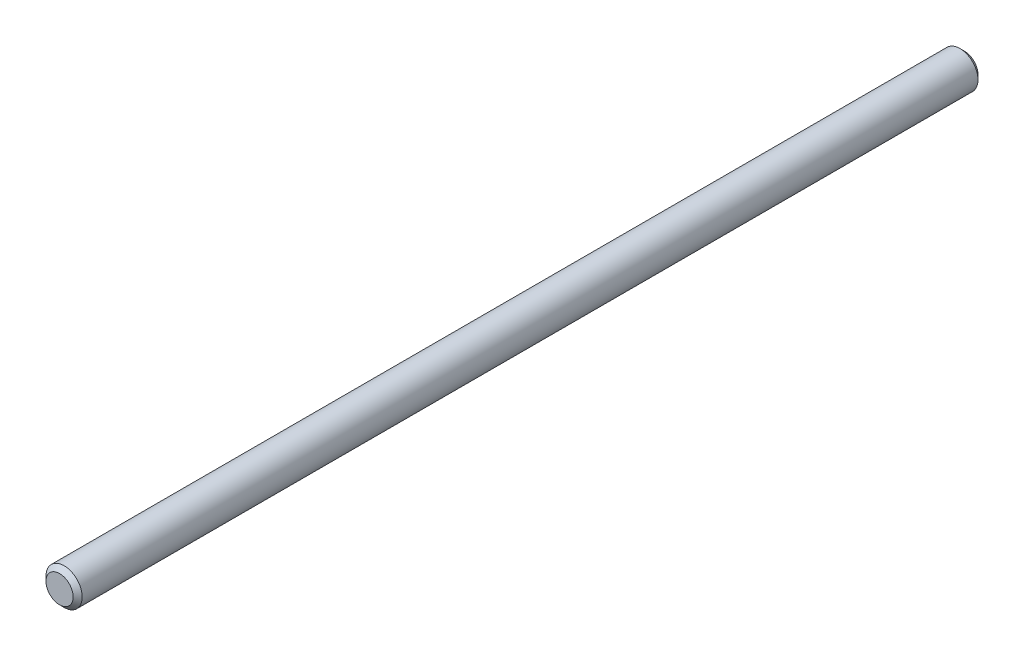
ISO-10303-21;
HEADER;
FILE_DESCRIPTION(('STEP AP214'),'2;1');
FILE_NAME('part.step','',(''),(''),'','','');
FILE_SCHEMA(('AUTOMOTIVE_DESIGN { 1 0 10303 214 1 1 1 1 }'));
ENDSEC;
DATA;
#1=APPLICATION_CONTEXT('core data for automotive mechanical design processes');
#2=APPLICATION_PROTOCOL_DEFINITION('international standard','automotive_design',2000,#1);
#3=PRODUCT_CONTEXT('',#1,'mechanical');
#4=PRODUCT('Part','Part','',(#3));
#5=PRODUCT_RELATED_PRODUCT_CATEGORY('part','',(#4));
#6=PRODUCT_DEFINITION_FORMATION('','',#4);
#7=PRODUCT_DEFINITION_CONTEXT('part definition',#1,'design');
#8=PRODUCT_DEFINITION('design','',#6,#7);
#9=PRODUCT_DEFINITION_SHAPE('','',#8);
#10=(LENGTH_UNIT() NAMED_UNIT(*) SI_UNIT(.MILLI.,.METRE.));
#11=(NAMED_UNIT(*) PLANE_ANGLE_UNIT() SI_UNIT($,.RADIAN.));
#12=(NAMED_UNIT(*) SI_UNIT($,.STERADIAN.) SOLID_ANGLE_UNIT());
#13=UNCERTAINTY_MEASURE_WITH_UNIT(LENGTH_MEASURE(1.E-05),#10,'distance_accuracy_value','');
#14=(GEOMETRIC_REPRESENTATION_CONTEXT(3) GLOBAL_UNCERTAINTY_ASSIGNED_CONTEXT((#13)) GLOBAL_UNIT_ASSIGNED_CONTEXT((#10,
#11,#12)) REPRESENTATION_CONTEXT('',''));
#15=CARTESIAN_POINT('',(0.,0.,0.));
#16=DIRECTION('',(0.,0.,1.));
#17=DIRECTION('',(1.,0.,0.));
#18=AXIS2_PLACEMENT_3D('',#15,#16,#17);
#19=CARTESIAN_POINT('',(0.,0.,200.));
#20=DIRECTION('',(0.,0.,-1.));
#21=DIRECTION('',(-1.,0.,0.));
#22=AXIS2_PLACEMENT_3D('',#19,#20,#21);
#23=CYLINDRICAL_SURFACE('',#22,4.);
#24=CARTESIAN_POINT('',(0.,0.,1.00000000000003));
#25=DIRECTION('',(0.,0.,1.));
#26=DIRECTION('',(1.,0.,0.));
#27=AXIS2_PLACEMENT_3D('',#24,#25,#26);
#28=CIRCLE('',#27,4.);
#29=CARTESIAN_POINT('',(4.,0.,1.00000000000003));
#30=VERTEX_POINT('',#29);
#31=EDGE_CURVE('E59',#30,#30,#28,.T.);
#32=ORIENTED_EDGE('',*,*,#31,.T.);
#33=EDGE_LOOP('',(#32));
#34=FACE_BOUND('',#33,.T.);
#35=CARTESIAN_POINT('',(0.,0.,199.));
#36=DIRECTION('',(0.,0.,1.));
#37=DIRECTION('',(1.,0.,0.));
#38=AXIS2_PLACEMENT_3D('',#35,#36,#37);
#39=CIRCLE('',#38,4.);
#40=CARTESIAN_POINT('',(4.,0.,199.));
#41=VERTEX_POINT('',#40);
#42=EDGE_CURVE('E64',#41,#41,#39,.F.);
#43=ORIENTED_EDGE('',*,*,#42,.T.);
#44=EDGE_LOOP('',(#43));
#45=FACE_BOUND('',#44,.T.);
#46=ADVANCED_FACE('F45',(#34,#45),#23,.T.);
#47=CARTESIAN_POINT('',(0.,0.,200.));
#48=DIRECTION('',(0.,0.,1.));
#49=DIRECTION('',(1.,0.,0.));
#50=AXIS2_PLACEMENT_3D('',#47,#48,#49);
#51=PLANE('',#50);
#52=CARTESIAN_POINT('',(0.,0.,200.));
#53=DIRECTION('',(0.,0.,1.));
#54=DIRECTION('',(1.,0.,0.));
#55=AXIS2_PLACEMENT_3D('',#52,#53,#54);
#56=CIRCLE('',#55,3.00000000000006);
#57=CARTESIAN_POINT('',(3.00000000000006,0.,200.));
#58=VERTEX_POINT('',#57);
#59=EDGE_CURVE('E10',#58,#58,#56,.T.);
#60=ORIENTED_EDGE('',*,*,#59,.T.);
#61=EDGE_LOOP('',(#60));
#62=FACE_BOUND('',#61,.T.);
#63=ADVANCED_FACE('F81',(#62),#51,.T.);
#64=CARTESIAN_POINT('',(0.,0.,0.));
#65=DIRECTION('',(0.,0.,1.));
#66=DIRECTION('',(1.,0.,0.));
#67=AXIS2_PLACEMENT_3D('',#64,#65,#66);
#68=PLANE('',#67);
#69=CARTESIAN_POINT('',(0.,0.,0.));
#70=DIRECTION('',(0.,0.,1.));
#71=DIRECTION('',(1.,0.,0.));
#72=AXIS2_PLACEMENT_3D('',#69,#70,#71);
#73=CIRCLE('',#72,2.99999999999995);
#74=CARTESIAN_POINT('',(2.99999999999995,0.,0.));
#75=VERTEX_POINT('',#74);
#76=EDGE_CURVE('E54',#75,#75,#73,.F.);
#77=ORIENTED_EDGE('',*,*,#76,.T.);
#78=EDGE_LOOP('',(#77));
#79=FACE_BOUND('',#78,.T.);
#80=ADVANCED_FACE('F78',(#79),#68,.F.);
#81=CARTESIAN_POINT('',(0.,0.,1.00000000000003));
#82=DIRECTION('',(0.,0.,1.));
#83=DIRECTION('',(1.,0.,0.));
#84=AXIS2_PLACEMENT_3D('',#81,#82,#83);
#85=CONICAL_SURFACE('',#84,4.,0.78539816339746);
#86=ORIENTED_EDGE('',*,*,#76,.F.);
#87=EDGE_LOOP('',(#86));
#88=FACE_BOUND('',#87,.T.);
#89=ORIENTED_EDGE('',*,*,#31,.F.);
#90=EDGE_LOOP('',(#89));
#91=FACE_BOUND('',#90,.T.);
#92=ADVANCED_FACE('F74',(#88,#91),#85,.T.);
#93=CARTESIAN_POINT('',(0.,0.,200.));
#94=DIRECTION('',(0.,0.,-1.));
#95=DIRECTION('',(-1.,0.,0.));
#96=AXIS2_PLACEMENT_3D('',#93,#94,#95);
#97=CONICAL_SURFACE('',#96,3.00000000000006,0.785398163397447);
#98=ORIENTED_EDGE('',*,*,#42,.F.);
#99=EDGE_LOOP('',(#98));
#100=FACE_BOUND('',#99,.T.);
#101=ORIENTED_EDGE('',*,*,#59,.F.);
#102=EDGE_LOOP('',(#101));
#103=FACE_BOUND('',#102,.T.);
#104=ADVANCED_FACE('F48',(#100,#103),#97,.T.);
#105=CLOSED_SHELL('',(#46,#63,#80,#92,#104));
#106=MANIFOLD_SOLID_BREP('B2',#105);
#107=ADVANCED_BREP_SHAPE_REPRESENTATION('',(#18,#106),#14);
#108=SHAPE_DEFINITION_REPRESENTATION(#9,#107);
ENDSEC;
END-ISO-10303-21;
